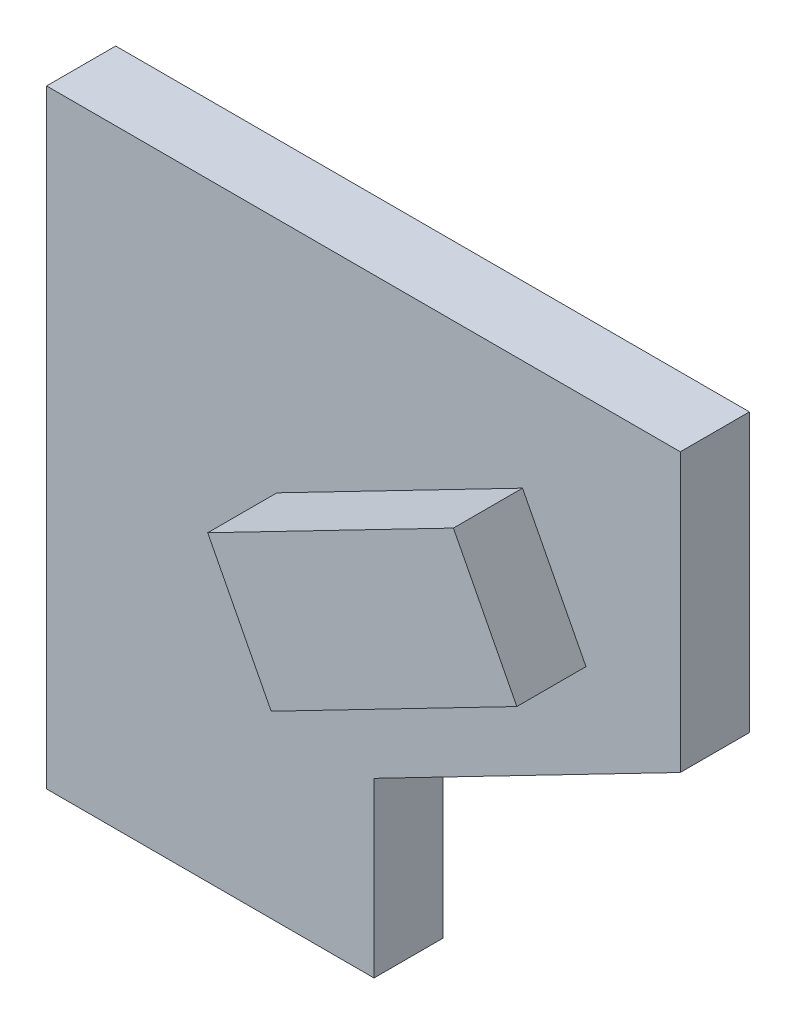
ISO-10303-21;
HEADER;
FILE_DESCRIPTION(('STEP AP214'),'2;1');
FILE_NAME('part.step','',(''),(''),'','','');
FILE_SCHEMA(('AUTOMOTIVE_DESIGN { 1 0 10303 214 1 1 1 1 }'));
ENDSEC;
DATA;
#1=APPLICATION_CONTEXT('core data for automotive mechanical design processes');
#2=APPLICATION_PROTOCOL_DEFINITION('international standard','automotive_design',2000,#1);
#3=PRODUCT_CONTEXT('',#1,'mechanical');
#4=PRODUCT('Part','Part','',(#3));
#5=PRODUCT_RELATED_PRODUCT_CATEGORY('part','',(#4));
#6=PRODUCT_DEFINITION_FORMATION('','',#4);
#7=PRODUCT_DEFINITION_CONTEXT('part definition',#1,'design');
#8=PRODUCT_DEFINITION('design','',#6,#7);
#9=PRODUCT_DEFINITION_SHAPE('','',#8);
#10=(LENGTH_UNIT() NAMED_UNIT(*) SI_UNIT(.MILLI.,.METRE.));
#11=(NAMED_UNIT(*) PLANE_ANGLE_UNIT() SI_UNIT($,.RADIAN.));
#12=(NAMED_UNIT(*) SI_UNIT($,.STERADIAN.) SOLID_ANGLE_UNIT());
#13=UNCERTAINTY_MEASURE_WITH_UNIT(LENGTH_MEASURE(1.E-05),#10,'distance_accuracy_value','');
#14=(GEOMETRIC_REPRESENTATION_CONTEXT(3) GLOBAL_UNCERTAINTY_ASSIGNED_CONTEXT((#13)) GLOBAL_UNIT_ASSIGNED_CONTEXT((#10,
#11,#12)) REPRESENTATION_CONTEXT('',''));
#15=CARTESIAN_POINT('',(0.,0.,0.));
#16=DIRECTION('',(0.,0.,1.));
#17=DIRECTION('',(1.,0.,0.));
#18=AXIS2_PLACEMENT_3D('',#15,#16,#17);
#19=CARTESIAN_POINT('',(0.,0.,10.));
#20=DIRECTION('',(0.,0.,1.));
#21=DIRECTION('',(1.,0.,0.));
#22=AXIS2_PLACEMENT_3D('',#19,#20,#21);
#23=PLANE('',#22);
#24=DIRECTION('',(0.,-1.,0.));
#25=VECTOR('',#24,1.);
#26=CARTESIAN_POINT('',(-21.9527720697546,58.0085371055333,10.));
#27=LINE('',#26,#25);
#28=CARTESIAN_POINT('',(-21.9527720697546,58.0085371055333,10.));
#29=VERTEX_POINT('',#28);
#30=CARTESIAN_POINT('',(-21.9527720697546,-30.0686453803911,10.));
#31=VERTEX_POINT('',#30);
#32=EDGE_CURVE('E163',#29,#31,#27,.T.);
#33=ORIENTED_EDGE('',*,*,#32,.T.);
#34=DIRECTION('',(1.,0.,0.));
#35=VECTOR('',#34,1.);
#36=CARTESIAN_POINT('',(-21.9527720697546,-30.0686453803911,10.));
#37=LINE('',#36,#35);
#38=CARTESIAN_POINT('',(25.4119967595341,-30.0686453803911,10.));
#39=VERTEX_POINT('',#38);
#40=EDGE_CURVE('E103',#31,#39,#37,.T.);
#41=ORIENTED_EDGE('',*,*,#40,.T.);
#42=DIRECTION('',(0.,1.,0.));
#43=VECTOR('',#42,1.);
#44=CARTESIAN_POINT('',(25.4119967595341,-30.0686453803911,10.));
#45=LINE('',#44,#43);
#46=CARTESIAN_POINT('',(25.4119967595341,-5.05578993121621,10.));
#47=VERTEX_POINT('',#46);
#48=EDGE_CURVE('E120',#39,#47,#45,.T.);
#49=ORIENTED_EDGE('',*,*,#48,.T.);
#50=DIRECTION('',(0.888480304068256,0.458914751650871,0.));
#51=VECTOR('',#50,1.);
#52=CARTESIAN_POINT('',(25.4119967595341,-5.05578993121621,10.));
#53=LINE('',#52,#51);
#54=CARTESIAN_POINT('',(69.7166822094024,17.8283118627098,10.));
#55=VERTEX_POINT('',#54);
#56=EDGE_CURVE('E113',#47,#55,#53,.T.);
#57=ORIENTED_EDGE('',*,*,#56,.T.);
#58=DIRECTION('',(0.,1.,0.));
#59=VECTOR('',#58,1.);
#60=CARTESIAN_POINT('',(69.7166822094024,17.8283118627098,10.));
#61=LINE('',#60,#59);
#62=CARTESIAN_POINT('',(69.7166822094024,58.0085371055333,10.));
#63=VERTEX_POINT('',#62);
#64=EDGE_CURVE('E117',#55,#63,#61,.T.);
#65=ORIENTED_EDGE('',*,*,#64,.T.);
#66=DIRECTION('',(-1.,0.,0.));
#67=VECTOR('',#66,1.);
#68=CARTESIAN_POINT('',(69.7166822094024,58.0085371055333,10.));
#69=LINE('',#68,#67);
#70=EDGE_CURVE('E68',#63,#29,#69,.T.);
#71=ORIENTED_EDGE('',*,*,#70,.T.);
#72=EDGE_LOOP('',(#33,#41,#49,#57,#65,#71));
#73=FACE_BOUND('',#72,.T.);
#74=DIRECTION('',(-0.888480304068252,-0.458914751650877,0.));
#75=VECTOR('',#74,1.);
#76=CARTESIAN_POINT('',(11.3566379791628,23.6834570757369,10.));
#77=LINE('',#76,#75);
#78=CARTESIAN_POINT('',(46.8958501418929,42.040047141772,10.));
#79=VERTEX_POINT('',#78);
#80=CARTESIAN_POINT('',(11.3566379791628,23.6834570757369,10.));
#81=VERTEX_POINT('',#80);
#82=EDGE_CURVE('E208',#79,#81,#77,.T.);
#83=ORIENTED_EDGE('',*,*,#82,.F.);
#84=DIRECTION('',(-0.458914751650877,0.888480304068252,0.));
#85=VECTOR('',#84,1.);
#86=CARTESIAN_POINT('',(46.8958501418929,42.040047141772,10.));
#87=LINE('',#86,#85);
#88=CARTESIAN_POINT('',(56.0741451749104,24.2704410604069,10.));
#89=VERTEX_POINT('',#88);
#90=EDGE_CURVE('E212',#89,#79,#87,.T.);
#91=ORIENTED_EDGE('',*,*,#90,.F.);
#92=DIRECTION('',(0.888480304068252,0.458914751650877,0.));
#93=VECTOR('',#92,1.);
#94=CARTESIAN_POINT('',(20.5349330121803,5.91385099437186,10.));
#95=LINE('',#94,#93);
#96=CARTESIAN_POINT('',(20.5349330121803,5.91385099437187,10.));
#97=VERTEX_POINT('',#96);
#98=EDGE_CURVE('E201',#97,#89,#95,.T.);
#99=ORIENTED_EDGE('',*,*,#98,.F.);
#100=DIRECTION('',(0.458914751650877,-0.888480304068252,0.));
#101=VECTOR('',#100,1.);
#102=CARTESIAN_POINT('',(11.3566379791628,23.6834570757369,10.));
#103=LINE('',#102,#101);
#104=EDGE_CURVE('E205',#81,#97,#103,.T.);
#105=ORIENTED_EDGE('',*,*,#104,.F.);
#106=EDGE_LOOP('',(#83,#91,#99,#105));
#107=FACE_BOUND('',#106,.T.);
#108=ADVANCED_FACE('F43',(#73,#107),#23,.T.);
#109=CARTESIAN_POINT('',(-21.9527720697546,58.0085371055333,10.));
#110=DIRECTION('',(1.,0.,0.));
#111=DIRECTION('',(0.,0.,-1.));
#112=AXIS2_PLACEMENT_3D('',#109,#110,#111);
#113=PLANE('',#112);
#114=DIRECTION('',(0.,-1.,0.));
#115=VECTOR('',#114,1.);
#116=CARTESIAN_POINT('',(-21.9527720697546,58.0085371055333,0.));
#117=LINE('',#116,#115);
#118=CARTESIAN_POINT('',(-21.9527720697546,58.0085371055333,0.));
#119=VERTEX_POINT('',#118);
#120=CARTESIAN_POINT('',(-21.9527720697546,-30.0686453803911,0.));
#121=VERTEX_POINT('',#120);
#122=EDGE_CURVE('E145',#119,#121,#117,.T.);
#123=ORIENTED_EDGE('',*,*,#122,.T.);
#124=DIRECTION('',(0.,0.,-1.));
#125=VECTOR('',#124,1.);
#126=CARTESIAN_POINT('',(-21.9527720697546,-30.0686453803911,10.));
#127=LINE('',#126,#125);
#128=EDGE_CURVE('E11',#31,#121,#127,.T.);
#129=ORIENTED_EDGE('',*,*,#128,.F.);
#130=ORIENTED_EDGE('',*,*,#32,.F.);
#131=DIRECTION('',(0.,0.,-1.));
#132=VECTOR('',#131,1.);
#133=CARTESIAN_POINT('',(-21.9527720697546,58.0085371055333,10.));
#134=LINE('',#133,#132);
#135=EDGE_CURVE('E141',#29,#119,#134,.T.);
#136=ORIENTED_EDGE('',*,*,#135,.T.);
#137=EDGE_LOOP('',(#123,#129,#130,#136));
#138=FACE_BOUND('',#137,.T.);
#139=ADVANCED_FACE('F45',(#138),#113,.F.);
#140=CARTESIAN_POINT('',(-21.9527720697546,-30.0686453803911,10.));
#141=DIRECTION('',(0.,1.,0.));
#142=DIRECTION('',(0.,0.,1.));
#143=AXIS2_PLACEMENT_3D('',#140,#141,#142);
#144=PLANE('',#143);
#145=DIRECTION('',(1.,0.,0.));
#146=VECTOR('',#145,1.);
#147=CARTESIAN_POINT('',(-21.9527720697546,-30.0686453803911,0.));
#148=LINE('',#147,#146);
#149=CARTESIAN_POINT('',(25.4119967595341,-30.0686453803911,0.));
#150=VERTEX_POINT('',#149);
#151=EDGE_CURVE('E149',#121,#150,#148,.T.);
#152=ORIENTED_EDGE('',*,*,#151,.T.);
#153=DIRECTION('',(0.,0.,-1.));
#154=VECTOR('',#153,1.);
#155=CARTESIAN_POINT('',(25.4119967595341,-30.0686453803911,10.));
#156=LINE('',#155,#154);
#157=EDGE_CURVE('E52',#39,#150,#156,.T.);
#158=ORIENTED_EDGE('',*,*,#157,.F.);
#159=ORIENTED_EDGE('',*,*,#40,.F.);
#160=ORIENTED_EDGE('',*,*,#128,.T.);
#161=EDGE_LOOP('',(#152,#158,#159,#160));
#162=FACE_BOUND('',#161,.T.);
#163=ADVANCED_FACE('F263',(#162),#144,.F.);
#164=CARTESIAN_POINT('',(25.4119967595341,-30.0686453803911,10.));
#165=DIRECTION('',(-1.,0.,0.));
#166=DIRECTION('',(0.,0.,1.));
#167=AXIS2_PLACEMENT_3D('',#164,#165,#166);
#168=PLANE('',#167);
#169=DIRECTION('',(0.,1.,0.));
#170=VECTOR('',#169,1.);
#171=CARTESIAN_POINT('',(25.4119967595341,-30.0686453803911,0.));
#172=LINE('',#171,#170);
#173=CARTESIAN_POINT('',(25.4119967595341,-5.05578993121621,0.));
#174=VERTEX_POINT('',#173);
#175=EDGE_CURVE('E153',#150,#174,#172,.T.);
#176=ORIENTED_EDGE('',*,*,#175,.T.);
#177=DIRECTION('',(0.,0.,-1.));
#178=VECTOR('',#177,1.);
#179=CARTESIAN_POINT('',(25.4119967595341,-5.05578993121621,10.));
#180=LINE('',#179,#178);
#181=EDGE_CURVE('E134',#47,#174,#180,.T.);
#182=ORIENTED_EDGE('',*,*,#181,.F.);
#183=ORIENTED_EDGE('',*,*,#48,.F.);
#184=ORIENTED_EDGE('',*,*,#157,.T.);
#185=EDGE_LOOP('',(#176,#182,#183,#184));
#186=FACE_BOUND('',#185,.T.);
#187=ADVANCED_FACE('F173',(#186),#168,.F.);
#188=CARTESIAN_POINT('',(25.4119967595341,-5.05578993121621,10.));
#189=DIRECTION('',(-0.458914751650871,0.888480304068256,0.));
#190=DIRECTION('',(-0.888480304068256,-0.458914751650871,0.));
#191=AXIS2_PLACEMENT_3D('',#188,#189,#190);
#192=PLANE('',#191);
#193=DIRECTION('',(0.888480304068256,0.458914751650871,0.));
#194=VECTOR('',#193,1.);
#195=CARTESIAN_POINT('',(25.4119967595341,-5.05578993121621,0.));
#196=LINE('',#195,#194);
#197=CARTESIAN_POINT('',(69.7166822094024,17.8283118627098,0.));
#198=VERTEX_POINT('',#197);
#199=EDGE_CURVE('E130',#174,#198,#196,.T.);
#200=ORIENTED_EDGE('',*,*,#199,.T.);
#201=DIRECTION('',(0.,0.,-1.));
#202=VECTOR('',#201,1.);
#203=CARTESIAN_POINT('',(69.7166822094024,17.8283118627098,10.));
#204=LINE('',#203,#202);
#205=EDGE_CURVE('E127',#55,#198,#204,.T.);
#206=ORIENTED_EDGE('',*,*,#205,.F.);
#207=ORIENTED_EDGE('',*,*,#56,.F.);
#208=ORIENTED_EDGE('',*,*,#181,.T.);
#209=EDGE_LOOP('',(#200,#206,#207,#208));
#210=FACE_BOUND('',#209,.T.);
#211=ADVANCED_FACE('F128',(#210),#192,.F.);
#212=CARTESIAN_POINT('',(69.7166822094024,17.8283118627098,10.));
#213=DIRECTION('',(-1.,0.,0.));
#214=DIRECTION('',(0.,0.,1.));
#215=AXIS2_PLACEMENT_3D('',#212,#213,#214);
#216=PLANE('',#215);
#217=DIRECTION('',(0.,1.,0.));
#218=VECTOR('',#217,1.);
#219=CARTESIAN_POINT('',(69.7166822094024,17.8283118627098,0.));
#220=LINE('',#219,#218);
#221=CARTESIAN_POINT('',(69.7166822094024,58.0085371055333,0.));
#222=VERTEX_POINT('',#221);
#223=EDGE_CURVE('E158',#198,#222,#220,.T.);
#224=ORIENTED_EDGE('',*,*,#223,.T.);
#225=DIRECTION('',(0.,0.,-1.));
#226=VECTOR('',#225,1.);
#227=CARTESIAN_POINT('',(69.7166822094024,58.0085371055333,10.));
#228=LINE('',#227,#226);
#229=EDGE_CURVE('E135',#63,#222,#228,.T.);
#230=ORIENTED_EDGE('',*,*,#229,.F.);
#231=ORIENTED_EDGE('',*,*,#64,.F.);
#232=ORIENTED_EDGE('',*,*,#205,.T.);
#233=EDGE_LOOP('',(#224,#230,#231,#232));
#234=FACE_BOUND('',#233,.T.);
#235=ADVANCED_FACE('F137',(#234),#216,.F.);
#236=CARTESIAN_POINT('',(69.7166822094024,58.0085371055333,10.));
#237=DIRECTION('',(0.,-1.,0.));
#238=DIRECTION('',(0.,0.,-1.));
#239=AXIS2_PLACEMENT_3D('',#236,#237,#238);
#240=PLANE('',#239);
#241=DIRECTION('',(-1.,0.,0.));
#242=VECTOR('',#241,1.);
#243=CARTESIAN_POINT('',(69.7166822094024,58.0085371055333,0.));
#244=LINE('',#243,#242);
#245=EDGE_CURVE('E95',#222,#119,#244,.T.);
#246=ORIENTED_EDGE('',*,*,#245,.T.);
#247=ORIENTED_EDGE('',*,*,#135,.F.);
#248=ORIENTED_EDGE('',*,*,#70,.F.);
#249=ORIENTED_EDGE('',*,*,#229,.T.);
#250=EDGE_LOOP('',(#246,#247,#248,#249));
#251=FACE_BOUND('',#250,.T.);
#252=ADVANCED_FACE('F177',(#251),#240,.F.);
#253=CARTESIAN_POINT('',(0.,0.,0.));
#254=DIRECTION('',(0.,0.,1.));
#255=DIRECTION('',(1.,0.,0.));
#256=AXIS2_PLACEMENT_3D('',#253,#254,#255);
#257=PLANE('',#256);
#258=ORIENTED_EDGE('',*,*,#122,.F.);
#259=ORIENTED_EDGE('',*,*,#245,.F.);
#260=ORIENTED_EDGE('',*,*,#223,.F.);
#261=ORIENTED_EDGE('',*,*,#199,.F.);
#262=ORIENTED_EDGE('',*,*,#175,.F.);
#263=ORIENTED_EDGE('',*,*,#151,.F.);
#264=EDGE_LOOP('',(#258,#259,#260,#261,#262,#263));
#265=FACE_BOUND('',#264,.T.);
#266=ADVANCED_FACE('F176',(#265),#257,.F.);
#267=CARTESIAN_POINT('',(46.8958501418929,42.040047141772,20.));
#268=DIRECTION('',(-0.888480304068252,-0.458914751650877,0.));
#269=DIRECTION('',(0.458914751650877,-0.888480304068252,0.));
#270=AXIS2_PLACEMENT_3D('',#267,#268,#269);
#271=PLANE('',#270);
#272=ORIENTED_EDGE('',*,*,#90,.T.);
#273=DIRECTION('',(0.,0.,-1.));
#274=VECTOR('',#273,1.);
#275=CARTESIAN_POINT('',(46.8958501418929,42.040047141772,20.));
#276=LINE('',#275,#274);
#277=CARTESIAN_POINT('',(46.8958501418929,42.040047141772,20.));
#278=VERTEX_POINT('',#277);
#279=EDGE_CURVE('E150',#278,#79,#276,.T.);
#280=ORIENTED_EDGE('',*,*,#279,.F.);
#281=DIRECTION('',(-0.458914751650877,0.888480304068252,0.));
#282=VECTOR('',#281,1.);
#283=CARTESIAN_POINT('',(46.8958501418929,42.040047141772,20.));
#284=LINE('',#283,#282);
#285=CARTESIAN_POINT('',(56.0741451749104,24.2704410604069,20.));
#286=VERTEX_POINT('',#285);
#287=EDGE_CURVE('E204',#286,#278,#284,.T.);
#288=ORIENTED_EDGE('',*,*,#287,.F.);
#289=DIRECTION('',(0.,0.,-1.));
#290=VECTOR('',#289,1.);
#291=CARTESIAN_POINT('',(56.0741451749104,24.2704410604069,20.));
#292=LINE('',#291,#290);
#293=EDGE_CURVE('E196',#286,#89,#292,.T.);
#294=ORIENTED_EDGE('',*,*,#293,.T.);
#295=EDGE_LOOP('',(#272,#280,#288,#294));
#296=FACE_BOUND('',#295,.T.);
#297=ADVANCED_FACE('F240',(#296),#271,.F.);
#298=CARTESIAN_POINT('',(11.3566379791628,23.6834570757369,20.));
#299=DIRECTION('',(0.458914751650877,-0.888480304068252,0.));
#300=DIRECTION('',(0.888480304068252,0.458914751650877,0.));
#301=AXIS2_PLACEMENT_3D('',#298,#299,#300);
#302=PLANE('',#301);
#303=ORIENTED_EDGE('',*,*,#82,.T.);
#304=DIRECTION('',(0.,0.,-1.));
#305=VECTOR('',#304,1.);
#306=CARTESIAN_POINT('',(11.3566379791628,23.6834570757369,20.));
#307=LINE('',#306,#305);
#308=CARTESIAN_POINT('',(11.3566379791628,23.6834570757369,20.));
#309=VERTEX_POINT('',#308);
#310=EDGE_CURVE('E190',#309,#81,#307,.T.);
#311=ORIENTED_EDGE('',*,*,#310,.F.);
#312=DIRECTION('',(-0.888480304068252,-0.458914751650877,0.));
#313=VECTOR('',#312,1.);
#314=CARTESIAN_POINT('',(11.3566379791628,23.6834570757369,20.));
#315=LINE('',#314,#313);
#316=EDGE_CURVE('E223',#278,#309,#315,.T.);
#317=ORIENTED_EDGE('',*,*,#316,.F.);
#318=ORIENTED_EDGE('',*,*,#279,.T.);
#319=EDGE_LOOP('',(#303,#311,#317,#318));
#320=FACE_BOUND('',#319,.T.);
#321=ADVANCED_FACE('F245',(#320),#302,.F.);
#322=CARTESIAN_POINT('',(11.3566379791628,23.6834570757369,20.));
#323=DIRECTION('',(0.888480304068252,0.458914751650877,0.));
#324=DIRECTION('',(-0.458914751650877,0.888480304068252,0.));
#325=AXIS2_PLACEMENT_3D('',#322,#323,#324);
#326=PLANE('',#325);
#327=ORIENTED_EDGE('',*,*,#104,.T.);
#328=DIRECTION('',(0.,0.,-1.));
#329=VECTOR('',#328,1.);
#330=CARTESIAN_POINT('',(20.5349330121803,5.91385099437186,20.));
#331=LINE('',#330,#329);
#332=CARTESIAN_POINT('',(20.5349330121803,5.91385099437186,20.));
#333=VERTEX_POINT('',#332);
#334=EDGE_CURVE('E59',#333,#97,#331,.T.);
#335=ORIENTED_EDGE('',*,*,#334,.F.);
#336=DIRECTION('',(0.458914751650877,-0.888480304068252,0.));
#337=VECTOR('',#336,1.);
#338=CARTESIAN_POINT('',(11.3566379791628,23.6834570757369,20.));
#339=LINE('',#338,#337);
#340=EDGE_CURVE('E219',#309,#333,#339,.T.);
#341=ORIENTED_EDGE('',*,*,#340,.F.);
#342=ORIENTED_EDGE('',*,*,#310,.T.);
#343=EDGE_LOOP('',(#327,#335,#341,#342));
#344=FACE_BOUND('',#343,.T.);
#345=ADVANCED_FACE('F254',(#344),#326,.F.);
#346=CARTESIAN_POINT('',(20.5349330121803,5.91385099437186,20.));
#347=DIRECTION('',(-0.458914751650877,0.888480304068252,0.));
#348=DIRECTION('',(-0.888480304068252,-0.458914751650877,0.));
#349=AXIS2_PLACEMENT_3D('',#346,#347,#348);
#350=PLANE('',#349);
#351=ORIENTED_EDGE('',*,*,#98,.T.);
#352=ORIENTED_EDGE('',*,*,#293,.F.);
#353=DIRECTION('',(0.888480304068252,0.458914751650877,0.));
#354=VECTOR('',#353,1.);
#355=CARTESIAN_POINT('',(20.5349330121803,5.91385099437186,20.));
#356=LINE('',#355,#354);
#357=EDGE_CURVE('E200',#333,#286,#356,.T.);
#358=ORIENTED_EDGE('',*,*,#357,.F.);
#359=ORIENTED_EDGE('',*,*,#334,.T.);
#360=EDGE_LOOP('',(#351,#352,#358,#359));
#361=FACE_BOUND('',#360,.T.);
#362=ADVANCED_FACE('F257',(#361),#350,.F.);
#363=CARTESIAN_POINT('',(0.,0.,20.));
#364=DIRECTION('',(0.,0.,1.));
#365=DIRECTION('',(1.,0.,0.));
#366=AXIS2_PLACEMENT_3D('',#363,#364,#365);
#367=PLANE('',#366);
#368=ORIENTED_EDGE('',*,*,#287,.T.);
#369=ORIENTED_EDGE('',*,*,#316,.T.);
#370=ORIENTED_EDGE('',*,*,#340,.T.);
#371=ORIENTED_EDGE('',*,*,#357,.T.);
#372=EDGE_LOOP('',(#368,#369,#370,#371));
#373=FACE_BOUND('',#372,.T.);
#374=ADVANCED_FACE('F233',(#373),#367,.T.);
#375=CLOSED_SHELL('',(#108,#139,#163,#187,#211,#235,#252,#266,#297,#321,#345,#362,#374));
#376=MANIFOLD_SOLID_BREP('B2',#375);
#377=ADVANCED_BREP_SHAPE_REPRESENTATION('',(#18,#376),#14);
#378=SHAPE_DEFINITION_REPRESENTATION(#9,#377);
ENDSEC;
END-ISO-10303-21;
